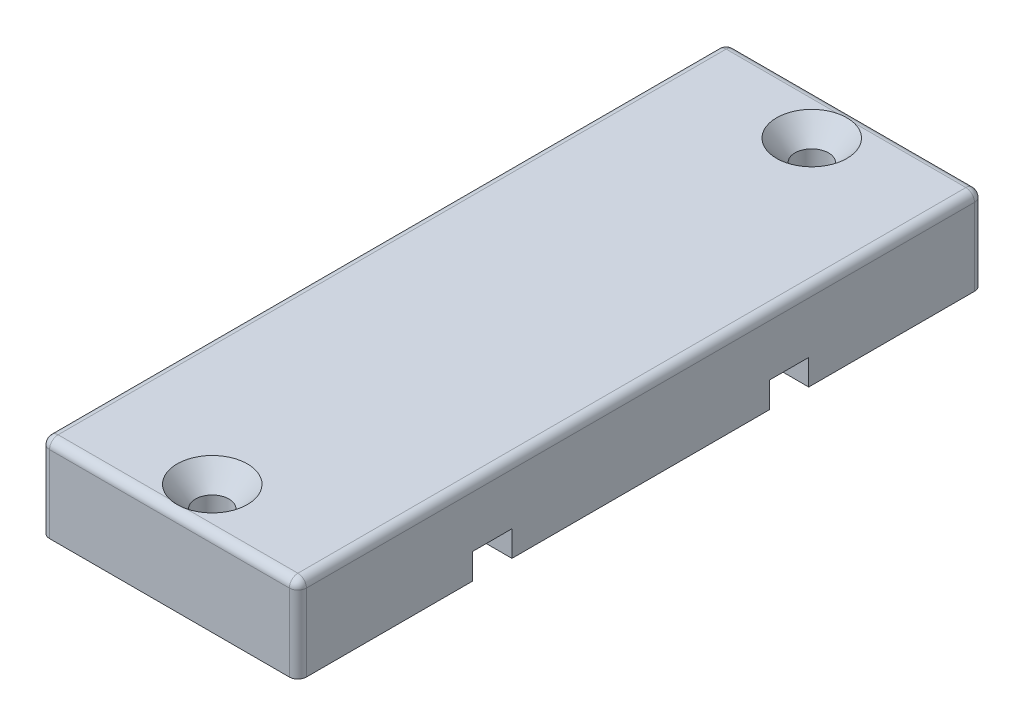
ISO-10303-21;
HEADER;
FILE_DESCRIPTION(('STEP AP214'),'2;1');
FILE_NAME('part.step','',(''),(''),'','','');
FILE_SCHEMA(('AUTOMOTIVE_DESIGN { 1 0 10303 214 1 1 1 1 }'));
ENDSEC;
DATA;
#1=APPLICATION_CONTEXT('core data for automotive mechanical design processes');
#2=APPLICATION_PROTOCOL_DEFINITION('international standard','automotive_design',2000,#1);
#3=PRODUCT_CONTEXT('',#1,'mechanical');
#4=PRODUCT('Part','Part','',(#3));
#5=PRODUCT_RELATED_PRODUCT_CATEGORY('part','',(#4));
#6=PRODUCT_DEFINITION_FORMATION('','',#4);
#7=PRODUCT_DEFINITION_CONTEXT('part definition',#1,'design');
#8=PRODUCT_DEFINITION('design','',#6,#7);
#9=PRODUCT_DEFINITION_SHAPE('','',#8);
#10=(LENGTH_UNIT() NAMED_UNIT(*) SI_UNIT(.MILLI.,.METRE.));
#11=(NAMED_UNIT(*) PLANE_ANGLE_UNIT() SI_UNIT($,.RADIAN.));
#12=(NAMED_UNIT(*) SI_UNIT($,.STERADIAN.) SOLID_ANGLE_UNIT());
#13=UNCERTAINTY_MEASURE_WITH_UNIT(LENGTH_MEASURE(1.E-05),#10,'distance_accuracy_value','');
#14=(GEOMETRIC_REPRESENTATION_CONTEXT(3) GLOBAL_UNCERTAINTY_ASSIGNED_CONTEXT((#13)) GLOBAL_UNIT_ASSIGNED_CONTEXT((#10,
#11,#12)) REPRESENTATION_CONTEXT('',''));
#15=CARTESIAN_POINT('',(0.,0.,0.));
#16=DIRECTION('',(0.,0.,1.));
#17=DIRECTION('',(1.,0.,0.));
#18=AXIS2_PLACEMENT_3D('',#15,#16,#17);
#19=CARTESIAN_POINT('',(0.,0.,0.));
#20=DIRECTION('',(0.,-1.,0.));
#21=DIRECTION('',(0.,0.,-1.));
#22=AXIS2_PLACEMENT_3D('',#19,#20,#21);
#23=PLANE('',#22);
#24=DIRECTION('',(-1.,0.,0.));
#25=VECTOR('',#24,1.);
#26=CARTESIAN_POINT('',(0.,0.,-101.6));
#27=LINE('',#26,#25);
#28=CARTESIAN_POINT('',(36.83,0.,-101.6));
#29=VERTEX_POINT('',#28);
#30=CARTESIAN_POINT('',(1.26999999999999,0.,-101.6));
#31=VERTEX_POINT('',#30);
#32=EDGE_CURVE('E264',#29,#31,#27,.T.);
#33=ORIENTED_EDGE('',*,*,#32,.F.);
#34=CARTESIAN_POINT('',(36.83,0.,-100.33));
#35=DIRECTION('',(0.,-1.,0.));
#36=DIRECTION('',(0.,0.,-1.));
#37=AXIS2_PLACEMENT_3D('',#34,#35,#36);
#38=CIRCLE('',#37,1.27);
#39=CARTESIAN_POINT('',(38.1,0.,-100.33));
#40=VERTEX_POINT('',#39);
#41=EDGE_CURVE('E280',#29,#40,#38,.T.);
#42=ORIENTED_EDGE('',*,*,#41,.T.);
#43=DIRECTION('',(0.,0.,-1.));
#44=VECTOR('',#43,1.);
#45=CARTESIAN_POINT('',(38.1,0.,-101.6));
#46=LINE('',#45,#44);
#47=CARTESIAN_POINT('',(38.1,0.,-75.753849));
#48=VERTEX_POINT('',#47);
#49=EDGE_CURVE('E261',#48,#40,#46,.T.);
#50=ORIENTED_EDGE('',*,*,#49,.F.);
#51=DIRECTION('',(-1.,0.,0.));
#52=VECTOR('',#51,1.);
#53=CARTESIAN_POINT('',(38.1,0.,-75.753849));
#54=LINE('',#53,#52);
#55=CARTESIAN_POINT('',(0.,0.,-75.753849));
#56=VERTEX_POINT('',#55);
#57=EDGE_CURVE('E211',#48,#56,#54,.T.);
#58=ORIENTED_EDGE('',*,*,#57,.T.);
#59=DIRECTION('',(0.,0.,1.));
#60=VECTOR('',#59,1.);
#61=CARTESIAN_POINT('',(0.,0.,0.));
#62=LINE('',#61,#60);
#63=CARTESIAN_POINT('',(0.,0.,-100.33));
#64=VERTEX_POINT('',#63);
#65=EDGE_CURVE('E268',#64,#56,#62,.T.);
#66=ORIENTED_EDGE('',*,*,#65,.F.);
#67=CARTESIAN_POINT('',(1.26999999999999,0.,-100.33));
#68=DIRECTION('',(0.,-1.,0.));
#69=DIRECTION('',(0.,0.,-1.));
#70=AXIS2_PLACEMENT_3D('',#67,#68,#69);
#71=CIRCLE('',#70,1.27);
#72=EDGE_CURVE('E278',#64,#31,#71,.T.);
#73=ORIENTED_EDGE('',*,*,#72,.T.);
#74=EDGE_LOOP('',(#33,#42,#50,#58,#66,#73));
#75=FACE_BOUND('',#74,.T.);
#76=CARTESIAN_POINT('',(19.05,0.,-95.25));
#77=DIRECTION('',(0.,1.,0.));
#78=DIRECTION('',(0.,0.,1.));
#79=AXIS2_PLACEMENT_3D('',#76,#77,#78);
#80=CIRCLE('',#79,2.48919999999999);
#81=CARTESIAN_POINT('',(19.05,0.,-92.7608));
#82=VERTEX_POINT('',#81);
#83=EDGE_CURVE('E246',#82,#82,#80,.T.);
#84=ORIENTED_EDGE('',*,*,#83,.T.);
#85=EDGE_LOOP('',(#84));
#86=FACE_BOUND('',#85,.T.);
#87=ADVANCED_FACE('F37',(#75,#86),#23,.T.);
#88=DIRECTION('',(-1.,0.,0.));
#89=VECTOR('',#88,1.);
#90=CARTESIAN_POINT('',(38.1,0.,-69.9155828));
#91=LINE('',#90,#89);
#92=CARTESIAN_POINT('',(38.1,0.,-69.9155828));
#93=VERTEX_POINT('',#92);
#94=CARTESIAN_POINT('',(0.,0.,-69.9155828));
#95=VERTEX_POINT('',#94);
#96=EDGE_CURVE('E185',#93,#95,#91,.T.);
#97=ORIENTED_EDGE('',*,*,#96,.F.);
#98=CARTESIAN_POINT('',(38.1,0.,-31.7410338));
#99=VERTEX_POINT('',#98);
#100=EDGE_CURVE('E200',#99,#93,#46,.T.);
#101=ORIENTED_EDGE('',*,*,#100,.F.);
#102=DIRECTION('',(-1.,0.,0.));
#103=VECTOR('',#102,1.);
#104=CARTESIAN_POINT('',(38.1,0.,-31.7410338));
#105=LINE('',#104,#103);
#106=CARTESIAN_POINT('',(0.,0.,-31.7410338));
#107=VERTEX_POINT('',#106);
#108=EDGE_CURVE('E224',#99,#107,#105,.T.);
#109=ORIENTED_EDGE('',*,*,#108,.T.);
#110=EDGE_CURVE('E271',#95,#107,#62,.T.);
#111=ORIENTED_EDGE('',*,*,#110,.F.);
#112=EDGE_LOOP('',(#97,#101,#109,#111));
#113=FACE_BOUND('',#112,.T.);
#114=ADVANCED_FACE('F346',(#113),#23,.T.);
#115=CARTESIAN_POINT('',(38.1,12.7,0.));
#116=DIRECTION('',(0.,0.,-1.));
#117=DIRECTION('',(-1.,0.,0.));
#118=AXIS2_PLACEMENT_3D('',#115,#116,#117);
#119=PLANE('',#118);
#120=DIRECTION('',(1.,0.,0.));
#121=VECTOR('',#120,1.);
#122=CARTESIAN_POINT('',(38.1,0.,0.));
#123=LINE('',#122,#121);
#124=CARTESIAN_POINT('',(1.27,0.,0.));
#125=VERTEX_POINT('',#124);
#126=CARTESIAN_POINT('',(36.83,0.,0.));
#127=VERTEX_POINT('',#126);
#128=EDGE_CURVE('E258',#125,#127,#123,.T.);
#129=ORIENTED_EDGE('',*,*,#128,.T.);
#130=DIRECTION('',(0.,-1.,0.));
#131=VECTOR('',#130,1.);
#132=CARTESIAN_POINT('',(36.83,12.7,0.));
#133=LINE('',#132,#131);
#134=CARTESIAN_POINT('',(36.83,11.43,0.));
#135=VERTEX_POINT('',#134);
#136=EDGE_CURVE('E309',#127,#135,#133,.F.);
#137=ORIENTED_EDGE('',*,*,#136,.T.);
#138=DIRECTION('',(1.,0.,0.));
#139=VECTOR('',#138,1.);
#140=CARTESIAN_POINT('',(38.1,11.43,0.));
#141=LINE('',#140,#139);
#142=CARTESIAN_POINT('',(1.27,11.43,0.));
#143=VERTEX_POINT('',#142);
#144=EDGE_CURVE('E307',#135,#143,#141,.F.);
#145=ORIENTED_EDGE('',*,*,#144,.T.);
#146=DIRECTION('',(0.,-1.,0.));
#147=VECTOR('',#146,1.);
#148=CARTESIAN_POINT('',(1.27,12.7,0.));
#149=LINE('',#148,#147);
#150=EDGE_CURVE('E305',#143,#125,#149,.T.);
#151=ORIENTED_EDGE('',*,*,#150,.T.);
#152=EDGE_LOOP('',(#129,#137,#145,#151));
#153=FACE_BOUND('',#152,.T.);
#154=ADVANCED_FACE('F355',(#153),#119,.F.);
#155=CARTESIAN_POINT('',(38.1,12.7,-101.6));
#156=DIRECTION('',(-1.,0.,0.));
#157=DIRECTION('',(0.,0.,1.));
#158=AXIS2_PLACEMENT_3D('',#155,#156,#157);
#159=PLANE('',#158);
#160=ORIENTED_EDGE('',*,*,#49,.T.);
#161=DIRECTION('',(0.,-1.,0.));
#162=VECTOR('',#161,1.);
#163=CARTESIAN_POINT('',(38.1,12.7,-100.33));
#164=LINE('',#163,#162);
#165=CARTESIAN_POINT('',(38.1,11.43,-100.33));
#166=VERTEX_POINT('',#165);
#167=EDGE_CURVE('E286',#40,#166,#164,.F.);
#168=ORIENTED_EDGE('',*,*,#167,.T.);
#169=DIRECTION('',(0.,0.,-1.));
#170=VECTOR('',#169,1.);
#171=CARTESIAN_POINT('',(38.1,11.43,-101.6));
#172=LINE('',#171,#170);
#173=CARTESIAN_POINT('',(38.1,11.43,-1.27000000000001));
#174=VERTEX_POINT('',#173);
#175=EDGE_CURVE('E284',#166,#174,#172,.F.);
#176=ORIENTED_EDGE('',*,*,#175,.T.);
#177=DIRECTION('',(0.,-1.,0.));
#178=VECTOR('',#177,1.);
#179=CARTESIAN_POINT('',(38.1,12.7,-1.27000000000001));
#180=LINE('',#179,#178);
#181=CARTESIAN_POINT('',(38.1,0.,-1.27000000000001));
#182=VERTEX_POINT('',#181);
#183=EDGE_CURVE('E282',#174,#182,#180,.T.);
#184=ORIENTED_EDGE('',*,*,#183,.T.);
#185=CARTESIAN_POINT('',(38.1,0.,-25.9027676));
#186=VERTEX_POINT('',#185);
#187=EDGE_CURVE('E262',#182,#186,#46,.T.);
#188=ORIENTED_EDGE('',*,*,#187,.T.);
#189=DIRECTION('',(0.,1.,0.));
#190=VECTOR('',#189,1.);
#191=CARTESIAN_POINT('',(38.1,3.81,-25.9027676));
#192=LINE('',#191,#190);
#193=CARTESIAN_POINT('',(38.1,3.81,-25.9027676));
#194=VERTEX_POINT('',#193);
#195=EDGE_CURVE('E230',#186,#194,#192,.T.);
#196=ORIENTED_EDGE('',*,*,#195,.T.);
#197=DIRECTION('',(0.,0.,-1.));
#198=VECTOR('',#197,1.);
#199=CARTESIAN_POINT('',(38.1,3.81,-31.7410338));
#200=LINE('',#199,#198);
#201=CARTESIAN_POINT('',(38.1,3.81,-31.7410338));
#202=VERTEX_POINT('',#201);
#203=EDGE_CURVE('E236',#194,#202,#200,.T.);
#204=ORIENTED_EDGE('',*,*,#203,.T.);
#205=DIRECTION('',(0.,-1.,0.));
#206=VECTOR('',#205,1.);
#207=CARTESIAN_POINT('',(38.1,0.,-31.7410338));
#208=LINE('',#207,#206);
#209=EDGE_CURVE('E219',#202,#99,#208,.T.);
#210=ORIENTED_EDGE('',*,*,#209,.T.);
#211=ORIENTED_EDGE('',*,*,#100,.T.);
#212=DIRECTION('',(0.,1.,0.));
#213=VECTOR('',#212,1.);
#214=CARTESIAN_POINT('',(38.1,3.81,-69.9155828));
#215=LINE('',#214,#213);
#216=CARTESIAN_POINT('',(38.1,3.81,-69.9155828));
#217=VERTEX_POINT('',#216);
#218=EDGE_CURVE('E177',#93,#217,#215,.T.);
#219=ORIENTED_EDGE('',*,*,#218,.T.);
#220=DIRECTION('',(0.,0.,-1.));
#221=VECTOR('',#220,1.);
#222=CARTESIAN_POINT('',(38.1,3.81,-75.753849));
#223=LINE('',#222,#221);
#224=CARTESIAN_POINT('',(38.1,3.81,-75.753849));
#225=VERTEX_POINT('',#224);
#226=EDGE_CURVE('E188',#217,#225,#223,.T.);
#227=ORIENTED_EDGE('',*,*,#226,.T.);
#228=DIRECTION('',(0.,-1.,0.));
#229=VECTOR('',#228,1.);
#230=CARTESIAN_POINT('',(38.1,0.,-75.753849));
#231=LINE('',#230,#229);
#232=EDGE_CURVE('E193',#225,#48,#231,.T.);
#233=ORIENTED_EDGE('',*,*,#232,.T.);
#234=EDGE_LOOP('',(#160,#168,#176,#184,#188,#196,#204,#210,#211,#219,#227,#233));
#235=FACE_BOUND('',#234,.T.);
#236=ADVANCED_FACE('F197',(#235),#159,.F.);
#237=CARTESIAN_POINT('',(0.,12.7,-101.6));
#238=DIRECTION('',(0.,0.,1.));
#239=DIRECTION('',(1.,0.,0.));
#240=AXIS2_PLACEMENT_3D('',#237,#238,#239);
#241=PLANE('',#240);
#242=DIRECTION('',(-1.,0.,0.));
#243=VECTOR('',#242,1.);
#244=CARTESIAN_POINT('',(0.,11.43,-101.6));
#245=LINE('',#244,#243);
#246=CARTESIAN_POINT('',(1.26999999999999,11.43,-101.6));
#247=VERTEX_POINT('',#246);
#248=CARTESIAN_POINT('',(36.83,11.43,-101.6));
#249=VERTEX_POINT('',#248);
#250=EDGE_CURVE('E273',#247,#249,#245,.F.);
#251=ORIENTED_EDGE('',*,*,#250,.T.);
#252=DIRECTION('',(0.,-1.,0.));
#253=VECTOR('',#252,1.);
#254=CARTESIAN_POINT('',(36.83,12.7,-101.6));
#255=LINE('',#254,#253);
#256=EDGE_CURVE('E275',#249,#29,#255,.T.);
#257=ORIENTED_EDGE('',*,*,#256,.T.);
#258=ORIENTED_EDGE('',*,*,#32,.T.);
#259=DIRECTION('',(0.,-1.,0.));
#260=VECTOR('',#259,1.);
#261=CARTESIAN_POINT('',(1.26999999999999,12.7,-101.6));
#262=LINE('',#261,#260);
#263=EDGE_CURVE('E270',#31,#247,#262,.F.);
#264=ORIENTED_EDGE('',*,*,#263,.T.);
#265=EDGE_LOOP('',(#251,#257,#258,#264));
#266=FACE_BOUND('',#265,.T.);
#267=ADVANCED_FACE('F349',(#266),#241,.F.);
#268=CARTESIAN_POINT('',(0.,12.7,0.));
#269=DIRECTION('',(1.,0.,0.));
#270=DIRECTION('',(0.,0.,-1.));
#271=AXIS2_PLACEMENT_3D('',#268,#269,#270);
#272=PLANE('',#271);
#273=CARTESIAN_POINT('',(0.,0.,-25.9027676));
#274=VERTEX_POINT('',#273);
#275=CARTESIAN_POINT('',(0.,0.,-1.27));
#276=VERTEX_POINT('',#275);
#277=EDGE_CURVE('E267',#274,#276,#62,.T.);
#278=ORIENTED_EDGE('',*,*,#277,.T.);
#279=DIRECTION('',(0.,-1.,0.));
#280=VECTOR('',#279,1.);
#281=CARTESIAN_POINT('',(0.,12.7,-1.27));
#282=LINE('',#281,#280);
#283=CARTESIAN_POINT('',(0.,11.43,-1.27));
#284=VERTEX_POINT('',#283);
#285=EDGE_CURVE('E46',#276,#284,#282,.F.);
#286=ORIENTED_EDGE('',*,*,#285,.T.);
#287=DIRECTION('',(0.,0.,1.));
#288=VECTOR('',#287,1.);
#289=CARTESIAN_POINT('',(0.,11.43,0.));
#290=LINE('',#289,#288);
#291=CARTESIAN_POINT('',(0.,11.43,-100.33));
#292=VERTEX_POINT('',#291);
#293=EDGE_CURVE('E58',#284,#292,#290,.F.);
#294=ORIENTED_EDGE('',*,*,#293,.T.);
#295=DIRECTION('',(0.,-1.,0.));
#296=VECTOR('',#295,1.);
#297=CARTESIAN_POINT('',(0.,12.7,-100.33));
#298=LINE('',#297,#296);
#299=EDGE_CURVE('E319',#292,#64,#298,.T.);
#300=ORIENTED_EDGE('',*,*,#299,.T.);
#301=ORIENTED_EDGE('',*,*,#65,.T.);
#302=DIRECTION('',(0.,-1.,0.));
#303=VECTOR('',#302,1.);
#304=CARTESIAN_POINT('',(0.,0.,-75.753849));
#305=LINE('',#304,#303);
#306=CARTESIAN_POINT('',(0.,3.81,-75.753849));
#307=VERTEX_POINT('',#306);
#308=EDGE_CURVE('E201',#307,#56,#305,.T.);
#309=ORIENTED_EDGE('',*,*,#308,.F.);
#310=DIRECTION('',(0.,0.,-1.));
#311=VECTOR('',#310,1.);
#312=CARTESIAN_POINT('',(0.,3.81,-75.753849));
#313=LINE('',#312,#311);
#314=CARTESIAN_POINT('',(0.,3.81,-69.9155828));
#315=VERTEX_POINT('',#314);
#316=EDGE_CURVE('E204',#315,#307,#313,.T.);
#317=ORIENTED_EDGE('',*,*,#316,.F.);
#318=DIRECTION('',(0.,1.,0.));
#319=VECTOR('',#318,1.);
#320=CARTESIAN_POINT('',(0.,3.81,-69.9155828));
#321=LINE('',#320,#319);
#322=EDGE_CURVE('E180',#95,#315,#321,.T.);
#323=ORIENTED_EDGE('',*,*,#322,.F.);
#324=ORIENTED_EDGE('',*,*,#110,.T.);
#325=DIRECTION('',(0.,-1.,0.));
#326=VECTOR('',#325,1.);
#327=CARTESIAN_POINT('',(0.,0.,-31.7410338));
#328=LINE('',#327,#326);
#329=CARTESIAN_POINT('',(0.,3.81,-31.7410338));
#330=VERTEX_POINT('',#329);
#331=EDGE_CURVE('E227',#330,#107,#328,.T.);
#332=ORIENTED_EDGE('',*,*,#331,.F.);
#333=DIRECTION('',(0.,0.,-1.));
#334=VECTOR('',#333,1.);
#335=CARTESIAN_POINT('',(0.,3.81,-31.7410338));
#336=LINE('',#335,#334);
#337=CARTESIAN_POINT('',(0.,3.81,-25.9027676));
#338=VERTEX_POINT('',#337);
#339=EDGE_CURVE('E229',#338,#330,#336,.T.);
#340=ORIENTED_EDGE('',*,*,#339,.F.);
#341=DIRECTION('',(0.,1.,0.));
#342=VECTOR('',#341,1.);
#343=CARTESIAN_POINT('',(0.,3.81,-25.9027676));
#344=LINE('',#343,#342);
#345=EDGE_CURVE('E209',#274,#338,#344,.T.);
#346=ORIENTED_EDGE('',*,*,#345,.F.);
#347=EDGE_LOOP('',(#278,#286,#294,#300,#301,#309,#317,#323,#324,#332,#340,#346));
#348=FACE_BOUND('',#347,.T.);
#349=ADVANCED_FACE('F341',(#348),#272,.F.);
#350=CARTESIAN_POINT('',(0.,12.7,0.));
#351=DIRECTION('',(0.,-1.,0.));
#352=DIRECTION('',(0.,0.,-1.));
#353=AXIS2_PLACEMENT_3D('',#350,#351,#352);
#354=PLANE('',#353);
#355=CARTESIAN_POINT('',(19.05,12.7,-6.35));
#356=DIRECTION('',(0.,1.,0.));
#357=DIRECTION('',(0.,0.,1.));
#358=AXIS2_PLACEMENT_3D('',#355,#356,#357);
#359=CIRCLE('',#358,5.2197);
#360=CARTESIAN_POINT('',(20.2495282781161,12.7,-1.27000000000001));
#361=VERTEX_POINT('',#360);
#362=CARTESIAN_POINT('',(17.850471721884,12.7,-1.27000000000001));
#363=VERTEX_POINT('',#362);
#364=EDGE_CURVE('E249',#361,#363,#359,.T.);
#365=ORIENTED_EDGE('',*,*,#364,.F.);
#366=DIRECTION('',(1.,0.,0.));
#367=VECTOR('',#366,1.);
#368=CARTESIAN_POINT('',(0.,12.7,-1.27));
#369=LINE('',#368,#367);
#370=CARTESIAN_POINT('',(36.83,12.7,-1.27000000000001));
#371=VERTEX_POINT('',#370);
#372=EDGE_CURVE('E299',#361,#371,#369,.T.);
#373=ORIENTED_EDGE('',*,*,#372,.T.);
#374=DIRECTION('',(0.,0.,-1.));
#375=VECTOR('',#374,1.);
#376=CARTESIAN_POINT('',(36.83,12.7,0.));
#377=LINE('',#376,#375);
#378=CARTESIAN_POINT('',(36.83,12.7,-100.33));
#379=VERTEX_POINT('',#378);
#380=EDGE_CURVE('E296',#371,#379,#377,.T.);
#381=ORIENTED_EDGE('',*,*,#380,.T.);
#382=DIRECTION('',(-1.,0.,0.));
#383=VECTOR('',#382,1.);
#384=CARTESIAN_POINT('',(0.,12.7,-100.33));
#385=LINE('',#384,#383);
#386=CARTESIAN_POINT('',(20.2495282781161,12.7,-100.33));
#387=VERTEX_POINT('',#386);
#388=EDGE_CURVE('E294',#379,#387,#385,.T.);
#389=ORIENTED_EDGE('',*,*,#388,.T.);
#390=CARTESIAN_POINT('',(19.05,12.7,-95.25));
#391=DIRECTION('',(0.,1.,0.));
#392=DIRECTION('',(0.,0.,1.));
#393=AXIS2_PLACEMENT_3D('',#390,#391,#392);
#394=CIRCLE('',#393,5.2197);
#395=CARTESIAN_POINT('',(17.8504717218839,12.7,-100.33));
#396=VERTEX_POINT('',#395);
#397=EDGE_CURVE('E214',#396,#387,#394,.T.);
#398=ORIENTED_EDGE('',*,*,#397,.F.);
#399=DIRECTION('',(-1.,0.,0.));
#400=VECTOR('',#399,1.);
#401=CARTESIAN_POINT('',(0.,12.7,-100.33));
#402=LINE('',#401,#400);
#403=CARTESIAN_POINT('',(1.26999999999999,12.7,-100.33));
#404=VERTEX_POINT('',#403);
#405=EDGE_CURVE('E290',#396,#404,#402,.T.);
#406=ORIENTED_EDGE('',*,*,#405,.T.);
#407=DIRECTION('',(0.,0.,1.));
#408=VECTOR('',#407,1.);
#409=CARTESIAN_POINT('',(1.27,12.7,0.));
#410=LINE('',#409,#408);
#411=CARTESIAN_POINT('',(1.27,12.7,-1.27));
#412=VERTEX_POINT('',#411);
#413=EDGE_CURVE('E288',#404,#412,#410,.T.);
#414=ORIENTED_EDGE('',*,*,#413,.T.);
#415=DIRECTION('',(1.,0.,0.));
#416=VECTOR('',#415,1.);
#417=CARTESIAN_POINT('',(0.,12.7,-1.27));
#418=LINE('',#417,#416);
#419=EDGE_CURVE('E292',#412,#363,#418,.T.);
#420=ORIENTED_EDGE('',*,*,#419,.T.);
#421=EDGE_LOOP('',(#365,#373,#381,#389,#398,#406,#414,#420));
#422=FACE_BOUND('',#421,.T.);
#423=ADVANCED_FACE('F338',(#422),#354,.F.);
#424=ORIENTED_EDGE('',*,*,#187,.F.);
#425=CARTESIAN_POINT('',(36.83,0.,-1.27000000000001));
#426=DIRECTION('',(0.,-1.,0.));
#427=DIRECTION('',(0.,0.,-1.));
#428=AXIS2_PLACEMENT_3D('',#425,#426,#427);
#429=CIRCLE('',#428,1.27);
#430=EDGE_CURVE('E303',#182,#127,#429,.T.);
#431=ORIENTED_EDGE('',*,*,#430,.T.);
#432=ORIENTED_EDGE('',*,*,#128,.F.);
#433=CARTESIAN_POINT('',(1.27,0.,-1.27));
#434=DIRECTION('',(0.,-1.,0.));
#435=DIRECTION('',(0.,0.,-1.));
#436=AXIS2_PLACEMENT_3D('',#433,#434,#435);
#437=CIRCLE('',#436,1.27);
#438=EDGE_CURVE('E301',#125,#276,#437,.T.);
#439=ORIENTED_EDGE('',*,*,#438,.T.);
#440=ORIENTED_EDGE('',*,*,#277,.F.);
#441=DIRECTION('',(-1.,0.,0.));
#442=VECTOR('',#441,1.);
#443=CARTESIAN_POINT('',(38.1,0.,-25.9027676));
#444=LINE('',#443,#442);
#445=EDGE_CURVE('E217',#186,#274,#444,.T.);
#446=ORIENTED_EDGE('',*,*,#445,.F.);
#447=EDGE_LOOP('',(#424,#431,#432,#439,#440,#446));
#448=FACE_BOUND('',#447,.T.);
#449=CARTESIAN_POINT('',(19.05,0.,-6.35));
#450=DIRECTION('',(0.,1.,0.));
#451=DIRECTION('',(0.,0.,1.));
#452=AXIS2_PLACEMENT_3D('',#449,#450,#451);
#453=CIRCLE('',#452,2.48919999999999);
#454=CARTESIAN_POINT('',(19.05,0.,-3.86080000000001));
#455=VERTEX_POINT('',#454);
#456=EDGE_CURVE('E255',#455,#455,#453,.T.);
#457=ORIENTED_EDGE('',*,*,#456,.T.);
#458=EDGE_LOOP('',(#457));
#459=FACE_BOUND('',#458,.T.);
#460=ADVANCED_FACE('F336',(#448,#459),#23,.T.);
#461=CARTESIAN_POINT('',(19.05,12.7,-6.35));
#462=DIRECTION('',(0.,1.,0.));
#463=DIRECTION('',(0.,0.,1.));
#464=AXIS2_PLACEMENT_3D('',#461,#462,#463);
#465=CYLINDRICAL_SURFACE('',#464,2.48919999999999);
#466=ORIENTED_EDGE('',*,*,#456,.F.);
#467=EDGE_LOOP('',(#466));
#468=FACE_BOUND('',#467,.T.);
#469=CARTESIAN_POINT('',(19.05,9.55891906408301,-6.35));
#470=DIRECTION('',(0.,1.,0.));
#471=DIRECTION('',(0.,0.,1.));
#472=AXIS2_PLACEMENT_3D('',#469,#470,#471);
#473=CIRCLE('',#472,2.48919999999999);
#474=CARTESIAN_POINT('',(19.05,9.55891906408301,-3.86080000000001));
#475=VERTEX_POINT('',#474);
#476=EDGE_CURVE('E252',#475,#475,#473,.T.);
#477=ORIENTED_EDGE('',*,*,#476,.T.);
#478=EDGE_LOOP('',(#477));
#479=FACE_BOUND('',#478,.T.);
#480=ADVANCED_FACE('F331',(#468,#479),#465,.F.);
#481=CARTESIAN_POINT('',(19.05,12.7,-6.35));
#482=DIRECTION('',(0.,1.,0.));
#483=DIRECTION('',(0.,0.,1.));
#484=AXIS2_PLACEMENT_3D('',#481,#482,#483);
#485=CONICAL_SURFACE('',#484,5.2197,0.715584993317674);
#486=ORIENTED_EDGE('',*,*,#476,.F.);
#487=EDGE_LOOP('',(#486));
#488=FACE_BOUND('',#487,.T.);
#489=ORIENTED_EDGE('',*,*,#364,.T.);
#490=CARTESIAN_POINT('',(17.850471721884,12.7,-1.27000000000001));
#491=CARTESIAN_POINT('',(17.9227345787555,12.6999804439547,-1.25295336755055));
#492=CARTESIAN_POINT('',(17.9954072547494,12.69965677564,-1.23771080289475));
#493=CARTESIAN_POINT('',(18.141362642953,12.6986884206376,-1.21061773021532));
#494=CARTESIAN_POINT('',(18.2146451913315,12.6980438175897,-1.19876633967218));
#495=CARTESIAN_POINT('',(18.3616605713411,12.696720381956,-1.1782292077404));
#496=CARTESIAN_POINT('',(18.4353934745608,12.6960415437967,-1.16954398370425));
#497=CARTESIAN_POINT('',(18.5831554204098,12.6948216203101,-1.15520814212739));
#498=CARTESIAN_POINT('',(18.6571844833781,12.6942805446147,-1.14955773673969));
#499=CARTESIAN_POINT('',(18.8768386190978,12.6930657579877,-1.13716642838767));
#500=CARTESIAN_POINT('',(19.0227198666185,12.6927665896233,-1.13462070014165));
#501=CARTESIAN_POINT('',(19.3142020171541,12.6934045949667,-1.14069242001898));
#502=CARTESIAN_POINT('',(19.4598030069529,12.6943412892274,-1.14930553909712));
#503=CARTESIAN_POINT('',(19.658835853511,12.695998437604,-1.16914693964802));
#504=CARTESIAN_POINT('',(19.7127986089573,12.6964860293762,-1.17534660256169));
#505=CARTESIAN_POINT('',(19.8204925280121,12.6974624787993,-1.18942509771666));
#506=CARTESIAN_POINT('',(19.87422375096,12.6979513360672,-1.19730346994564));
#507=CARTESIAN_POINT('',(20.0357208844894,12.6992717838346,-1.22369791849486));
#508=CARTESIAN_POINT('',(20.1430519393379,12.6999485032897,-1.24490207906655));
#509=CARTESIAN_POINT('',(20.2495282781161,12.7,-1.27000000000001));
#510=B_SPLINE_CURVE_WITH_KNOTS('',3,(#490,#491,#492,#493,#494,#495,#496,#497,#498,#499,#500,
#501,#502,#503,#504,#505,#506,#507,#508,#509),.UNSPECIFIED.,.F.,.F.,(4,2,2,2,2,2,2,2,2,4),(0.,
0.222692789182244,0.445327571951891,0.667998717017379,0.890685426177442,1.32794022489535,
1.76502544255828,1.92796555803038,2.09086108073914,2.41887274245901),.UNSPECIFIED.);
#511=EDGE_CURVE('E311',#363,#361,#510,.T.);
#512=ORIENTED_EDGE('',*,*,#511,.T.);
#513=EDGE_LOOP('',(#489,#512));
#514=FACE_BOUND('',#513,.T.);
#515=ADVANCED_FACE('F325',(#488,#514),#485,.F.);
#516=CARTESIAN_POINT('',(19.05,12.7,-95.25));
#517=DIRECTION('',(0.,1.,0.));
#518=DIRECTION('',(0.,0.,1.));
#519=AXIS2_PLACEMENT_3D('',#516,#517,#518);
#520=CYLINDRICAL_SURFACE('',#519,2.48919999999999);
#521=ORIENTED_EDGE('',*,*,#83,.F.);
#522=EDGE_LOOP('',(#521));
#523=FACE_BOUND('',#522,.T.);
#524=CARTESIAN_POINT('',(19.05,9.55891906408301,-95.25));
#525=DIRECTION('',(0.,1.,0.));
#526=DIRECTION('',(0.,0.,1.));
#527=AXIS2_PLACEMENT_3D('',#524,#525,#526);
#528=CIRCLE('',#527,2.48919999999999);
#529=CARTESIAN_POINT('',(19.05,9.55891906408301,-92.7608));
#530=VERTEX_POINT('',#529);
#531=EDGE_CURVE('E243',#530,#530,#528,.T.);
#532=ORIENTED_EDGE('',*,*,#531,.T.);
#533=EDGE_LOOP('',(#532));
#534=FACE_BOUND('',#533,.T.);
#535=ADVANCED_FACE('F330',(#523,#534),#520,.F.);
#536=CARTESIAN_POINT('',(19.05,12.7,-95.25));
#537=DIRECTION('',(0.,1.,0.));
#538=DIRECTION('',(0.,0.,1.));
#539=AXIS2_PLACEMENT_3D('',#536,#537,#538);
#540=CONICAL_SURFACE('',#539,5.2197,0.715584993317674);
#541=ORIENTED_EDGE('',*,*,#531,.F.);
#542=EDGE_LOOP('',(#541));
#543=FACE_BOUND('',#542,.T.);
#544=ORIENTED_EDGE('',*,*,#397,.T.);
#545=CARTESIAN_POINT('',(20.2495282781161,12.7,-100.33));
#546=CARTESIAN_POINT('',(20.1772654212445,12.6999804439547,-100.347046632449));
#547=CARTESIAN_POINT('',(20.1045927452507,12.69965677564,-100.362289197105));
#548=CARTESIAN_POINT('',(19.9586373570471,12.6986884206376,-100.389382269785));
#549=CARTESIAN_POINT('',(19.8853548086686,12.6980438175897,-100.401233660328));
#550=CARTESIAN_POINT('',(19.738339428659,12.696720381956,-100.42177079226));
#551=CARTESIAN_POINT('',(19.6646065254392,12.6960415437967,-100.430456016296));
#552=CARTESIAN_POINT('',(19.5168445795903,12.6948216203101,-100.444791857873));
#553=CARTESIAN_POINT('',(19.442815516622,12.6942805446147,-100.45044226326));
#554=CARTESIAN_POINT('',(19.2231613809022,12.6930657579877,-100.462833571612));
#555=CARTESIAN_POINT('',(19.0772801333815,12.6927665896233,-100.465379299858));
#556=CARTESIAN_POINT('',(18.7857979828459,12.6934045949667,-100.459307579981));
#557=CARTESIAN_POINT('',(18.6401969930472,12.6943412892274,-100.450694460903));
#558=CARTESIAN_POINT('',(18.4411641464891,12.695998437604,-100.430853060352));
#559=CARTESIAN_POINT('',(18.3872013910428,12.6964860293762,-100.424653397438));
#560=CARTESIAN_POINT('',(18.279507471988,12.6974624787993,-100.410574902283));
#561=CARTESIAN_POINT('',(18.2257762490401,12.6979513360672,-100.402696530054));
#562=CARTESIAN_POINT('',(18.0642791155106,12.6992717838346,-100.376302081505));
#563=CARTESIAN_POINT('',(17.9569480606621,12.6999485032897,-100.355097920933));
#564=CARTESIAN_POINT('',(17.8504717218839,12.7,-100.33));
#565=B_SPLINE_CURVE_WITH_KNOTS('',3,(#545,#546,#547,#548,#549,#550,#551,#552,#553,#554,#555,
#556,#557,#558,#559,#560,#561,#562,#563,#564),.UNSPECIFIED.,.F.,.F.,(4,2,2,2,2,2,2,2,2,4),(0.,
0.222692789182241,0.445327571951891,0.667998717017376,0.890685426177442,1.32794022489535,
1.76502544255828,1.92796555803038,2.09086108073916,2.41887274245906),.UNSPECIFIED.);
#566=EDGE_CURVE('E11',#387,#396,#565,.T.);
#567=ORIENTED_EDGE('',*,*,#566,.T.);
#568=EDGE_LOOP('',(#544,#567));
#569=FACE_BOUND('',#568,.T.);
#570=ADVANCED_FACE('F382',(#543,#569),#540,.F.);
#571=CARTESIAN_POINT('',(38.1,0.,-31.7410338));
#572=DIRECTION('',(0.,0.,-1.));
#573=DIRECTION('',(-1.,0.,0.));
#574=AXIS2_PLACEMENT_3D('',#571,#572,#573);
#575=PLANE('',#574);
#576=ORIENTED_EDGE('',*,*,#331,.T.);
#577=ORIENTED_EDGE('',*,*,#108,.F.);
#578=ORIENTED_EDGE('',*,*,#209,.F.);
#579=DIRECTION('',(-1.,0.,0.));
#580=VECTOR('',#579,1.);
#581=CARTESIAN_POINT('',(38.1,3.81,-31.7410338));
#582=LINE('',#581,#580);
#583=EDGE_CURVE('E222',#202,#330,#582,.T.);
#584=ORIENTED_EDGE('',*,*,#583,.T.);
#585=EDGE_LOOP('',(#576,#577,#578,#584));
#586=FACE_BOUND('',#585,.T.);
#587=ADVANCED_FACE('F386',(#586),#575,.F.);
#588=CARTESIAN_POINT('',(38.1,3.81,-31.7410338));
#589=DIRECTION('',(0.,1.,0.));
#590=DIRECTION('',(0.,0.,1.));
#591=AXIS2_PLACEMENT_3D('',#588,#589,#590);
#592=PLANE('',#591);
#593=ORIENTED_EDGE('',*,*,#339,.T.);
#594=ORIENTED_EDGE('',*,*,#583,.F.);
#595=ORIENTED_EDGE('',*,*,#203,.F.);
#596=DIRECTION('',(-1.,0.,0.));
#597=VECTOR('',#596,1.);
#598=CARTESIAN_POINT('',(38.1,3.81,-25.9027676));
#599=LINE('',#598,#597);
#600=EDGE_CURVE('E220',#194,#338,#599,.T.);
#601=ORIENTED_EDGE('',*,*,#600,.T.);
#602=EDGE_LOOP('',(#593,#594,#595,#601));
#603=FACE_BOUND('',#602,.T.);
#604=ADVANCED_FACE('F390',(#603),#592,.F.);
#605=CARTESIAN_POINT('',(38.1,3.81,-25.9027676));
#606=DIRECTION('',(0.,0.,1.));
#607=DIRECTION('',(1.,0.,0.));
#608=AXIS2_PLACEMENT_3D('',#605,#606,#607);
#609=PLANE('',#608);
#610=ORIENTED_EDGE('',*,*,#345,.T.);
#611=ORIENTED_EDGE('',*,*,#600,.F.);
#612=ORIENTED_EDGE('',*,*,#195,.F.);
#613=ORIENTED_EDGE('',*,*,#445,.T.);
#614=EDGE_LOOP('',(#610,#611,#612,#613));
#615=FACE_BOUND('',#614,.T.);
#616=ADVANCED_FACE('F394',(#615),#609,.F.);
#617=CARTESIAN_POINT('',(38.1,0.,-75.753849));
#618=DIRECTION('',(0.,0.,-1.));
#619=DIRECTION('',(-1.,0.,0.));
#620=AXIS2_PLACEMENT_3D('',#617,#618,#619);
#621=PLANE('',#620);
#622=ORIENTED_EDGE('',*,*,#308,.T.);
#623=ORIENTED_EDGE('',*,*,#57,.F.);
#624=ORIENTED_EDGE('',*,*,#232,.F.);
#625=DIRECTION('',(-1.,0.,0.));
#626=VECTOR('',#625,1.);
#627=CARTESIAN_POINT('',(38.1,3.81,-75.753849));
#628=LINE('',#627,#626);
#629=EDGE_CURVE('E184',#225,#307,#628,.T.);
#630=ORIENTED_EDGE('',*,*,#629,.T.);
#631=EDGE_LOOP('',(#622,#623,#624,#630));
#632=FACE_BOUND('',#631,.T.);
#633=ADVANCED_FACE('F398',(#632),#621,.F.);
#634=CARTESIAN_POINT('',(38.1,3.81,-75.753849));
#635=DIRECTION('',(0.,1.,0.));
#636=DIRECTION('',(0.,0.,1.));
#637=AXIS2_PLACEMENT_3D('',#634,#635,#636);
#638=PLANE('',#637);
#639=ORIENTED_EDGE('',*,*,#316,.T.);
#640=ORIENTED_EDGE('',*,*,#629,.F.);
#641=ORIENTED_EDGE('',*,*,#226,.F.);
#642=DIRECTION('',(-1.,0.,0.));
#643=VECTOR('',#642,1.);
#644=CARTESIAN_POINT('',(38.1,3.81,-69.9155828));
#645=LINE('',#644,#643);
#646=EDGE_CURVE('E173',#217,#315,#645,.T.);
#647=ORIENTED_EDGE('',*,*,#646,.T.);
#648=EDGE_LOOP('',(#639,#640,#641,#647));
#649=FACE_BOUND('',#648,.T.);
#650=ADVANCED_FACE('F189',(#649),#638,.F.);
#651=CARTESIAN_POINT('',(38.1,3.81,-69.9155828));
#652=DIRECTION('',(0.,0.,1.));
#653=DIRECTION('',(1.,0.,0.));
#654=AXIS2_PLACEMENT_3D('',#651,#652,#653);
#655=PLANE('',#654);
#656=ORIENTED_EDGE('',*,*,#322,.T.);
#657=ORIENTED_EDGE('',*,*,#646,.F.);
#658=ORIENTED_EDGE('',*,*,#218,.F.);
#659=ORIENTED_EDGE('',*,*,#96,.T.);
#660=EDGE_LOOP('',(#656,#657,#658,#659));
#661=FACE_BOUND('',#660,.T.);
#662=ADVANCED_FACE('F175',(#661),#655,.F.);
#663=CARTESIAN_POINT('',(1.27,12.7,-1.27));
#664=DIRECTION('',(0.,-1.,0.));
#665=DIRECTION('',(0.,0.,-1.));
#666=AXIS2_PLACEMENT_3D('',#663,#664,#665);
#667=CYLINDRICAL_SURFACE('',#666,1.27);
#668=CARTESIAN_POINT('',(1.27,11.43,-1.27));
#669=DIRECTION('',(0.,1.,0.));
#670=DIRECTION('',(0.,0.,1.));
#671=AXIS2_PLACEMENT_3D('',#668,#669,#670);
#672=CIRCLE('',#671,1.27);
#673=EDGE_CURVE('E41',#284,#143,#672,.T.);
#674=ORIENTED_EDGE('',*,*,#673,.F.);
#675=ORIENTED_EDGE('',*,*,#285,.F.);
#676=ORIENTED_EDGE('',*,*,#438,.F.);
#677=ORIENTED_EDGE('',*,*,#150,.F.);
#678=EDGE_LOOP('',(#674,#675,#676,#677));
#679=FACE_BOUND('',#678,.T.);
#680=ADVANCED_FACE('F39',(#679),#667,.T.);
#681=CARTESIAN_POINT('',(1.27,11.43,-1.27));
#682=DIRECTION('',(0.,0.,1.));
#683=DIRECTION('',(1.,0.,0.));
#684=AXIS2_PLACEMENT_3D('',#681,#682,#683);
#685=SPHERICAL_SURFACE('',#684,1.27);
#686=CARTESIAN_POINT('',(1.27,11.43,-1.27));
#687=DIRECTION('',(0.,0.,1.));
#688=DIRECTION('',(1.,0.,0.));
#689=AXIS2_PLACEMENT_3D('',#686,#687,#688);
#690=CIRCLE('',#689,1.27);
#691=EDGE_CURVE('E441',#284,#412,#690,.F.);
#692=ORIENTED_EDGE('',*,*,#691,.F.);
#693=ORIENTED_EDGE('',*,*,#673,.T.);
#694=CARTESIAN_POINT('',(1.27,11.43,-1.27));
#695=DIRECTION('',(-1.,0.,0.));
#696=DIRECTION('',(0.,0.,1.));
#697=AXIS2_PLACEMENT_3D('',#694,#695,#696);
#698=CIRCLE('',#697,1.27);
#699=EDGE_CURVE('E458',#412,#143,#698,.F.);
#700=ORIENTED_EDGE('',*,*,#699,.F.);
#701=EDGE_LOOP('',(#692,#693,#700));
#702=FACE_BOUND('',#701,.T.);
#703=ADVANCED_FACE('F465',(#702),#685,.T.);
#704=CARTESIAN_POINT('',(36.83,12.7,-1.27000000000001));
#705=DIRECTION('',(0.,-1.,0.));
#706=DIRECTION('',(0.,0.,-1.));
#707=AXIS2_PLACEMENT_3D('',#704,#705,#706);
#708=CYLINDRICAL_SURFACE('',#707,1.27);
#709=ORIENTED_EDGE('',*,*,#430,.F.);
#710=ORIENTED_EDGE('',*,*,#183,.F.);
#711=CARTESIAN_POINT('',(36.83,11.43,-1.27000000000001));
#712=DIRECTION('',(0.,1.,0.));
#713=DIRECTION('',(0.,0.,1.));
#714=AXIS2_PLACEMENT_3D('',#711,#712,#713);
#715=CIRCLE('',#714,1.27);
#716=EDGE_CURVE('E450',#135,#174,#715,.T.);
#717=ORIENTED_EDGE('',*,*,#716,.F.);
#718=ORIENTED_EDGE('',*,*,#136,.F.);
#719=EDGE_LOOP('',(#709,#710,#717,#718));
#720=FACE_BOUND('',#719,.T.);
#721=ADVANCED_FACE('F478',(#720),#708,.T.);
#722=CARTESIAN_POINT('',(0.,11.43,-1.27));
#723=DIRECTION('',(1.,0.,0.));
#724=DIRECTION('',(0.,0.,-1.));
#725=AXIS2_PLACEMENT_3D('',#722,#723,#724);
#726=CYLINDRICAL_SURFACE('',#725,1.27);
#727=ORIENTED_EDGE('',*,*,#699,.T.);
#728=ORIENTED_EDGE('',*,*,#144,.F.);
#729=CARTESIAN_POINT('',(36.83,11.43,-1.27000000000001));
#730=DIRECTION('',(1.,0.,0.));
#731=DIRECTION('',(0.,0.,-1.));
#732=AXIS2_PLACEMENT_3D('',#729,#730,#731);
#733=CIRCLE('',#732,1.27);
#734=EDGE_CURVE('E447',#371,#135,#733,.T.);
#735=ORIENTED_EDGE('',*,*,#734,.F.);
#736=ORIENTED_EDGE('',*,*,#372,.F.);
#737=ORIENTED_EDGE('',*,*,#511,.F.);
#738=ORIENTED_EDGE('',*,*,#419,.F.);
#739=EDGE_LOOP('',(#727,#728,#735,#736,#737,#738));
#740=FACE_BOUND('',#739,.T.);
#741=ADVANCED_FACE('F321',(#740),#726,.T.);
#742=CARTESIAN_POINT('',(1.27,11.43,0.));
#743=DIRECTION('',(0.,0.,1.));
#744=DIRECTION('',(1.,0.,0.));
#745=AXIS2_PLACEMENT_3D('',#742,#743,#744);
#746=CYLINDRICAL_SURFACE('',#745,1.27);
#747=ORIENTED_EDGE('',*,*,#691,.T.);
#748=ORIENTED_EDGE('',*,*,#413,.F.);
#749=CARTESIAN_POINT('',(1.26999999999999,11.43,-100.33));
#750=DIRECTION('',(0.,0.,-1.));
#751=DIRECTION('',(-1.,0.,0.));
#752=AXIS2_PLACEMENT_3D('',#749,#750,#751);
#753=CIRCLE('',#752,1.27);
#754=EDGE_CURVE('E438',#292,#404,#753,.T.);
#755=ORIENTED_EDGE('',*,*,#754,.F.);
#756=ORIENTED_EDGE('',*,*,#293,.F.);
#757=EDGE_LOOP('',(#747,#748,#755,#756));
#758=FACE_BOUND('',#757,.T.);
#759=ADVANCED_FACE('F437',(#758),#746,.T.);
#760=CARTESIAN_POINT('',(1.26999999999999,12.7,-100.33));
#761=DIRECTION('',(0.,-1.,0.));
#762=DIRECTION('',(0.,0.,-1.));
#763=AXIS2_PLACEMENT_3D('',#760,#761,#762);
#764=CYLINDRICAL_SURFACE('',#763,1.27);
#765=ORIENTED_EDGE('',*,*,#72,.F.);
#766=ORIENTED_EDGE('',*,*,#299,.F.);
#767=CARTESIAN_POINT('',(1.26999999999999,11.43,-100.33));
#768=DIRECTION('',(0.,1.,0.));
#769=DIRECTION('',(0.,0.,1.));
#770=AXIS2_PLACEMENT_3D('',#767,#768,#769);
#771=CIRCLE('',#770,1.27);
#772=EDGE_CURVE('E446',#247,#292,#771,.T.);
#773=ORIENTED_EDGE('',*,*,#772,.F.);
#774=ORIENTED_EDGE('',*,*,#263,.F.);
#775=EDGE_LOOP('',(#765,#766,#773,#774));
#776=FACE_BOUND('',#775,.T.);
#777=ADVANCED_FACE('F504',(#776),#764,.T.);
#778=CARTESIAN_POINT('',(36.83,11.43,-1.27000000000001));
#779=DIRECTION('',(0.,0.,1.));
#780=DIRECTION('',(1.,0.,0.));
#781=AXIS2_PLACEMENT_3D('',#778,#779,#780);
#782=SPHERICAL_SURFACE('',#781,1.27);
#783=ORIENTED_EDGE('',*,*,#734,.T.);
#784=ORIENTED_EDGE('',*,*,#716,.T.);
#785=CARTESIAN_POINT('',(36.83,11.43,-1.27000000000001));
#786=DIRECTION('',(0.,0.,1.));
#787=DIRECTION('',(0.,-1.,0.));
#788=AXIS2_PLACEMENT_3D('',#785,#786,#787);
#789=CIRCLE('',#788,1.27);
#790=EDGE_CURVE('E452',#371,#174,#789,.F.);
#791=ORIENTED_EDGE('',*,*,#790,.F.);
#792=EDGE_LOOP('',(#783,#784,#791));
#793=FACE_BOUND('',#792,.T.);
#794=ADVANCED_FACE('F487',(#793),#782,.T.);
#795=CARTESIAN_POINT('',(1.26999999999999,11.43,-100.33));
#796=DIRECTION('',(-1.,0.,0.));
#797=DIRECTION('',(0.,0.,1.));
#798=AXIS2_PLACEMENT_3D('',#795,#796,#797);
#799=SPHERICAL_SURFACE('',#798,1.27);
#800=ORIENTED_EDGE('',*,*,#772,.T.);
#801=ORIENTED_EDGE('',*,*,#754,.T.);
#802=CARTESIAN_POINT('',(1.26999999999999,11.43,-100.33));
#803=DIRECTION('',(-1.,0.,0.));
#804=DIRECTION('',(0.,0.,1.));
#805=AXIS2_PLACEMENT_3D('',#802,#803,#804);
#806=CIRCLE('',#805,1.27);
#807=EDGE_CURVE('E430',#247,#404,#806,.F.);
#808=ORIENTED_EDGE('',*,*,#807,.F.);
#809=EDGE_LOOP('',(#800,#801,#808));
#810=FACE_BOUND('',#809,.T.);
#811=ADVANCED_FACE('F444',(#810),#799,.T.);
#812=CARTESIAN_POINT('',(36.83,11.43,0.));
#813=DIRECTION('',(0.,0.,-1.));
#814=DIRECTION('',(-1.,0.,0.));
#815=AXIS2_PLACEMENT_3D('',#812,#813,#814);
#816=CYLINDRICAL_SURFACE('',#815,1.27);
#817=ORIENTED_EDGE('',*,*,#790,.T.);
#818=ORIENTED_EDGE('',*,*,#175,.F.);
#819=CARTESIAN_POINT('',(36.83,11.43,-100.33));
#820=DIRECTION('',(0.,0.,-1.));
#821=DIRECTION('',(-1.,0.,0.));
#822=AXIS2_PLACEMENT_3D('',#819,#820,#821);
#823=CIRCLE('',#822,1.27);
#824=EDGE_CURVE('E492',#379,#166,#823,.T.);
#825=ORIENTED_EDGE('',*,*,#824,.F.);
#826=ORIENTED_EDGE('',*,*,#380,.F.);
#827=EDGE_LOOP('',(#817,#818,#825,#826));
#828=FACE_BOUND('',#827,.T.);
#829=ADVANCED_FACE('F371',(#828),#816,.T.);
#830=CARTESIAN_POINT('',(0.,11.43,-100.33));
#831=DIRECTION('',(-1.,0.,0.));
#832=DIRECTION('',(0.,0.,1.));
#833=AXIS2_PLACEMENT_3D('',#830,#831,#832);
#834=CYLINDRICAL_SURFACE('',#833,1.27);
#835=ORIENTED_EDGE('',*,*,#566,.F.);
#836=ORIENTED_EDGE('',*,*,#388,.F.);
#837=CARTESIAN_POINT('',(36.83,11.43,-100.33));
#838=DIRECTION('',(1.,0.,0.));
#839=DIRECTION('',(0.,0.,-1.));
#840=AXIS2_PLACEMENT_3D('',#837,#838,#839);
#841=CIRCLE('',#840,1.27);
#842=EDGE_CURVE('E496',#249,#379,#841,.T.);
#843=ORIENTED_EDGE('',*,*,#842,.F.);
#844=ORIENTED_EDGE('',*,*,#250,.F.);
#845=ORIENTED_EDGE('',*,*,#807,.T.);
#846=ORIENTED_EDGE('',*,*,#405,.F.);
#847=EDGE_LOOP('',(#835,#836,#843,#844,#845,#846));
#848=FACE_BOUND('',#847,.T.);
#849=ADVANCED_FACE('F366',(#848),#834,.T.);
#850=CARTESIAN_POINT('',(36.83,11.43,-100.33));
#851=DIRECTION('',(0.,1.,0.));
#852=DIRECTION('',(0.,0.,1.));
#853=AXIS2_PLACEMENT_3D('',#850,#851,#852);
#854=SPHERICAL_SURFACE('',#853,1.27);
#855=ORIENTED_EDGE('',*,*,#842,.T.);
#856=ORIENTED_EDGE('',*,*,#824,.T.);
#857=CARTESIAN_POINT('',(36.83,11.43,-100.33));
#858=DIRECTION('',(0.,1.,0.));
#859=DIRECTION('',(0.,0.,1.));
#860=AXIS2_PLACEMENT_3D('',#857,#858,#859);
#861=CIRCLE('',#860,1.27);
#862=EDGE_CURVE('E380',#249,#166,#861,.F.);
#863=ORIENTED_EDGE('',*,*,#862,.F.);
#864=EDGE_LOOP('',(#855,#856,#863));
#865=FACE_BOUND('',#864,.T.);
#866=ADVANCED_FACE('F362',(#865),#854,.T.);
#867=CARTESIAN_POINT('',(36.83,12.7,-100.33));
#868=DIRECTION('',(0.,-1.,0.));
#869=DIRECTION('',(0.,0.,-1.));
#870=AXIS2_PLACEMENT_3D('',#867,#868,#869);
#871=CYLINDRICAL_SURFACE('',#870,1.27);
#872=ORIENTED_EDGE('',*,*,#862,.T.);
#873=ORIENTED_EDGE('',*,*,#167,.F.);
#874=ORIENTED_EDGE('',*,*,#41,.F.);
#875=ORIENTED_EDGE('',*,*,#256,.F.);
#876=EDGE_LOOP('',(#872,#873,#874,#875));
#877=FACE_BOUND('',#876,.T.);
#878=ADVANCED_FACE('F359',(#877),#871,.T.);
#879=CLOSED_SHELL('',(#87,#114,#154,#236,#267,#349,#423,#460,#480,#515,#535,#570,#587,#604,#616,
#633,#650,#662,#680,#703,#721,#741,#759,#777,#794,#811,#829,#849,#866,#878));
#880=MANIFOLD_SOLID_BREP('B2',#879);
#881=ADVANCED_BREP_SHAPE_REPRESENTATION('',(#18,#880),#14);
#882=SHAPE_DEFINITION_REPRESENTATION(#9,#881);
ENDSEC;
END-ISO-10303-21;
